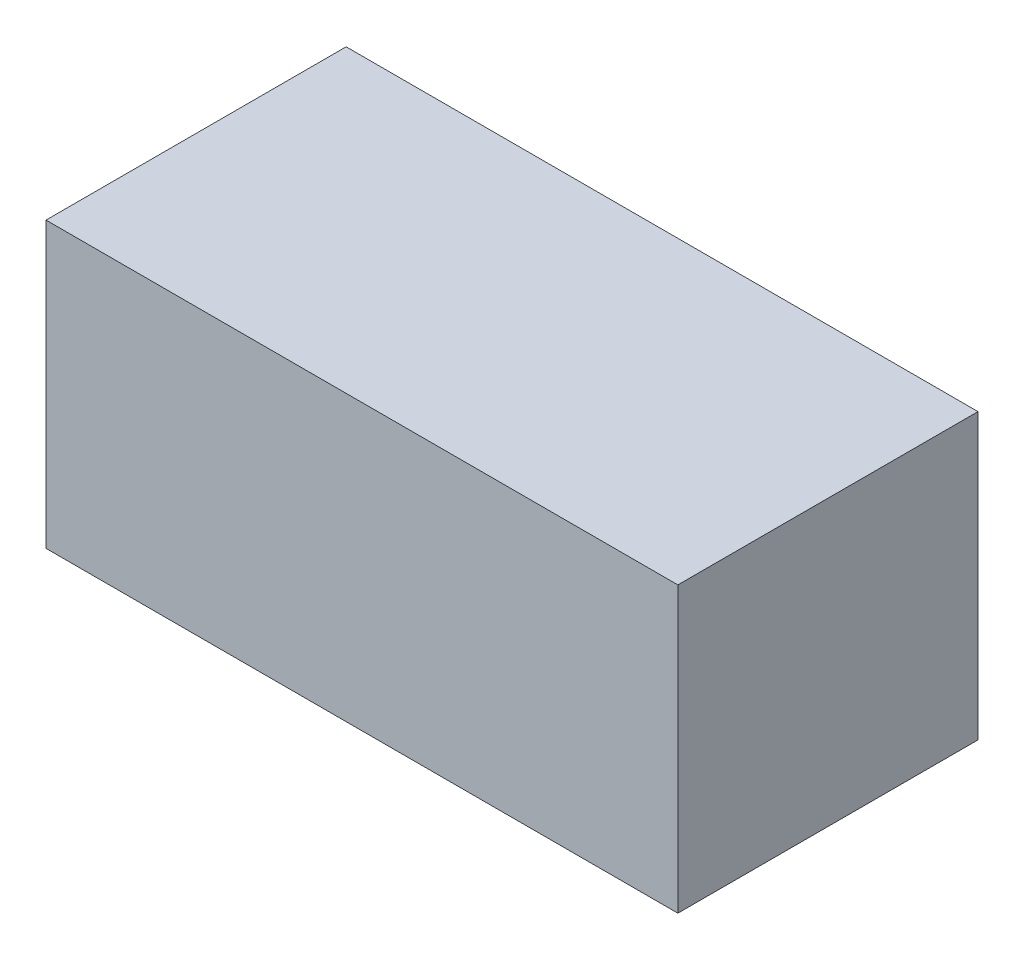
ISO-10303-21;
HEADER;
FILE_DESCRIPTION(('STEP AP214'),'2;1');
FILE_NAME('part.step','',(''),(''),'','','');
FILE_SCHEMA(('AUTOMOTIVE_DESIGN { 1 0 10303 214 1 1 1 1 }'));
ENDSEC;
DATA;
#1=APPLICATION_CONTEXT('core data for automotive mechanical design processes');
#2=APPLICATION_PROTOCOL_DEFINITION('international standard','automotive_design',2000,#1);
#3=PRODUCT_CONTEXT('',#1,'mechanical');
#4=PRODUCT('Part','Part','',(#3));
#5=PRODUCT_RELATED_PRODUCT_CATEGORY('part','',(#4));
#6=PRODUCT_DEFINITION_FORMATION('','',#4);
#7=PRODUCT_DEFINITION_CONTEXT('part definition',#1,'design');
#8=PRODUCT_DEFINITION('design','',#6,#7);
#9=PRODUCT_DEFINITION_SHAPE('','',#8);
#10=(LENGTH_UNIT() NAMED_UNIT(*) SI_UNIT(.MILLI.,.METRE.));
#11=(NAMED_UNIT(*) PLANE_ANGLE_UNIT() SI_UNIT($,.RADIAN.));
#12=(NAMED_UNIT(*) SI_UNIT($,.STERADIAN.) SOLID_ANGLE_UNIT());
#13=UNCERTAINTY_MEASURE_WITH_UNIT(LENGTH_MEASURE(1.E-05),#10,'distance_accuracy_value','');
#14=(GEOMETRIC_REPRESENTATION_CONTEXT(3) GLOBAL_UNCERTAINTY_ASSIGNED_CONTEXT((#13)) GLOBAL_UNIT_ASSIGNED_CONTEXT((#10,
#11,#12)) REPRESENTATION_CONTEXT('',''));
#15=CARTESIAN_POINT('',(0.,0.,0.));
#16=DIRECTION('',(0.,0.,1.));
#17=DIRECTION('',(1.,0.,0.));
#18=AXIS2_PLACEMENT_3D('',#15,#16,#17);
#19=CARTESIAN_POINT('',(0.,90.,-95.));
#20=DIRECTION('',(0.,0.,-1.));
#21=DIRECTION('',(-1.,0.,0.));
#22=AXIS2_PLACEMENT_3D('',#19,#20,#21);
#23=PLANE('',#22);
#24=DIRECTION('',(1.,0.,0.));
#25=VECTOR('',#24,1.);
#26=CARTESIAN_POINT('',(0.,0.,-95.));
#27=LINE('',#26,#25);
#28=CARTESIAN_POINT('',(0.,0.,-95.));
#29=VERTEX_POINT('',#28);
#30=CARTESIAN_POINT('',(200.,0.,-95.));
#31=VERTEX_POINT('',#30);
#32=EDGE_CURVE('E100',#29,#31,#27,.T.);
#33=ORIENTED_EDGE('',*,*,#32,.F.);
#34=DIRECTION('',(0.,-1.,0.));
#35=VECTOR('',#34,1.);
#36=CARTESIAN_POINT('',(0.,90.,-95.));
#37=LINE('',#36,#35);
#38=CARTESIAN_POINT('',(0.,90.,-95.));
#39=VERTEX_POINT('',#38);
#40=EDGE_CURVE('E11',#39,#29,#37,.T.);
#41=ORIENTED_EDGE('',*,*,#40,.F.);
#42=DIRECTION('',(1.,0.,0.));
#43=VECTOR('',#42,1.);
#44=CARTESIAN_POINT('',(0.,90.,-95.));
#45=LINE('',#44,#43);
#46=CARTESIAN_POINT('',(200.,90.,-95.));
#47=VERTEX_POINT('',#46);
#48=EDGE_CURVE('E93',#39,#47,#45,.T.);
#49=ORIENTED_EDGE('',*,*,#48,.T.);
#50=DIRECTION('',(0.,-1.,0.));
#51=VECTOR('',#50,1.);
#52=CARTESIAN_POINT('',(200.,90.,-95.));
#53=LINE('',#52,#51);
#54=EDGE_CURVE('E38',#47,#31,#53,.T.);
#55=ORIENTED_EDGE('',*,*,#54,.T.);
#56=EDGE_LOOP('',(#33,#41,#49,#55));
#57=FACE_BOUND('',#56,.T.);
#58=ADVANCED_FACE('F35',(#57),#23,.T.);
#59=CARTESIAN_POINT('',(0.,90.,0.));
#60=DIRECTION('',(-1.,0.,0.));
#61=DIRECTION('',(0.,0.,1.));
#62=AXIS2_PLACEMENT_3D('',#59,#60,#61);
#63=PLANE('',#62);
#64=DIRECTION('',(0.,0.,-1.));
#65=VECTOR('',#64,1.);
#66=CARTESIAN_POINT('',(0.,0.,0.));
#67=LINE('',#66,#65);
#68=CARTESIAN_POINT('',(0.,0.,0.));
#69=VERTEX_POINT('',#68);
#70=EDGE_CURVE('E95',#69,#29,#67,.T.);
#71=ORIENTED_EDGE('',*,*,#70,.F.);
#72=DIRECTION('',(0.,-1.,0.));
#73=VECTOR('',#72,1.);
#74=CARTESIAN_POINT('',(0.,90.,0.));
#75=LINE('',#74,#73);
#76=CARTESIAN_POINT('',(0.,90.,0.));
#77=VERTEX_POINT('',#76);
#78=EDGE_CURVE('E44',#77,#69,#75,.T.);
#79=ORIENTED_EDGE('',*,*,#78,.F.);
#80=DIRECTION('',(0.,0.,-1.));
#81=VECTOR('',#80,1.);
#82=CARTESIAN_POINT('',(0.,90.,0.));
#83=LINE('',#82,#81);
#84=EDGE_CURVE('E83',#77,#39,#83,.T.);
#85=ORIENTED_EDGE('',*,*,#84,.T.);
#86=ORIENTED_EDGE('',*,*,#40,.T.);
#87=EDGE_LOOP('',(#71,#79,#85,#86));
#88=FACE_BOUND('',#87,.T.);
#89=ADVANCED_FACE('F111',(#88),#63,.T.);
#90=CARTESIAN_POINT('',(0.,90.,0.));
#91=DIRECTION('',(0.,0.,-1.));
#92=DIRECTION('',(-1.,0.,0.));
#93=AXIS2_PLACEMENT_3D('',#90,#91,#92);
#94=PLANE('',#93);
#95=DIRECTION('',(1.,0.,0.));
#96=VECTOR('',#95,1.);
#97=CARTESIAN_POINT('',(0.,0.,0.));
#98=LINE('',#97,#96);
#99=CARTESIAN_POINT('',(200.,0.,0.));
#100=VERTEX_POINT('',#99);
#101=EDGE_CURVE('E88',#69,#100,#98,.T.);
#102=ORIENTED_EDGE('',*,*,#101,.T.);
#103=DIRECTION('',(0.,-1.,0.));
#104=VECTOR('',#103,1.);
#105=CARTESIAN_POINT('',(200.,90.,0.));
#106=LINE('',#105,#104);
#107=CARTESIAN_POINT('',(200.,90.,0.));
#108=VERTEX_POINT('',#107);
#109=EDGE_CURVE('E86',#108,#100,#106,.T.);
#110=ORIENTED_EDGE('',*,*,#109,.F.);
#111=DIRECTION('',(1.,0.,0.));
#112=VECTOR('',#111,1.);
#113=CARTESIAN_POINT('',(0.,90.,0.));
#114=LINE('',#113,#112);
#115=EDGE_CURVE('E80',#77,#108,#114,.T.);
#116=ORIENTED_EDGE('',*,*,#115,.F.);
#117=ORIENTED_EDGE('',*,*,#78,.T.);
#118=EDGE_LOOP('',(#102,#110,#116,#117));
#119=FACE_BOUND('',#118,.T.);
#120=ADVANCED_FACE('F87',(#119),#94,.F.);
#121=CARTESIAN_POINT('',(200.,90.,0.));
#122=DIRECTION('',(-1.,0.,0.));
#123=DIRECTION('',(0.,0.,1.));
#124=AXIS2_PLACEMENT_3D('',#121,#122,#123);
#125=PLANE('',#124);
#126=DIRECTION('',(0.,0.,-1.));
#127=VECTOR('',#126,1.);
#128=CARTESIAN_POINT('',(200.,0.,0.));
#129=LINE('',#128,#127);
#130=EDGE_CURVE('E103',#100,#31,#129,.T.);
#131=ORIENTED_EDGE('',*,*,#130,.T.);
#132=ORIENTED_EDGE('',*,*,#54,.F.);
#133=DIRECTION('',(0.,0.,-1.));
#134=VECTOR('',#133,1.);
#135=CARTESIAN_POINT('',(200.,90.,0.));
#136=LINE('',#135,#134);
#137=EDGE_CURVE('E77',#108,#47,#136,.T.);
#138=ORIENTED_EDGE('',*,*,#137,.F.);
#139=ORIENTED_EDGE('',*,*,#109,.T.);
#140=EDGE_LOOP('',(#131,#132,#138,#139));
#141=FACE_BOUND('',#140,.T.);
#142=ADVANCED_FACE('F92',(#141),#125,.F.);
#143=CARTESIAN_POINT('',(0.,90.,0.));
#144=DIRECTION('',(0.,1.,0.));
#145=DIRECTION('',(0.,0.,1.));
#146=AXIS2_PLACEMENT_3D('',#143,#144,#145);
#147=PLANE('',#146);
#148=ORIENTED_EDGE('',*,*,#48,.F.);
#149=ORIENTED_EDGE('',*,*,#84,.F.);
#150=ORIENTED_EDGE('',*,*,#115,.T.);
#151=ORIENTED_EDGE('',*,*,#137,.T.);
#152=EDGE_LOOP('',(#148,#149,#150,#151));
#153=FACE_BOUND('',#152,.T.);
#154=ADVANCED_FACE('F82',(#153),#147,.T.);
#155=CARTESIAN_POINT('',(0.,0.,0.));
#156=DIRECTION('',(0.,1.,0.));
#157=DIRECTION('',(0.,0.,1.));
#158=AXIS2_PLACEMENT_3D('',#155,#156,#157);
#159=PLANE('',#158);
#160=CARTESIAN_POINT('',(50.,0.,-47.5));
#161=DIRECTION('',(0.,-1.,0.));
#162=DIRECTION('',(0.,0.,-1.));
#163=AXIS2_PLACEMENT_3D('',#160,#161,#162);
#164=CIRCLE('',#163,30.);
#165=CARTESIAN_POINT('',(50.,0.,-77.5));
#166=VERTEX_POINT('',#165);
#167=EDGE_CURVE('E142',#166,#166,#164,.T.);
#168=ORIENTED_EDGE('',*,*,#167,.F.);
#169=EDGE_LOOP('',(#168));
#170=FACE_BOUND('',#169,.T.);
#171=ORIENTED_EDGE('',*,*,#32,.T.);
#172=ORIENTED_EDGE('',*,*,#130,.F.);
#173=ORIENTED_EDGE('',*,*,#101,.F.);
#174=ORIENTED_EDGE('',*,*,#70,.T.);
#175=EDGE_LOOP('',(#171,#172,#173,#174));
#176=FACE_BOUND('',#175,.T.);
#177=ADVANCED_FACE('F110',(#170,#176),#159,.F.);
#178=CARTESIAN_POINT('',(50.,10.,-47.5));
#179=DIRECTION('',(0.,-1.,0.));
#180=DIRECTION('',(0.,0.,-1.));
#181=AXIS2_PLACEMENT_3D('',#178,#179,#180);
#182=CYLINDRICAL_SURFACE('',#181,30.);
#183=CARTESIAN_POINT('',(50.,10.,-47.5));
#184=DIRECTION('',(0.,-1.,0.));
#185=DIRECTION('',(0.,0.,-1.));
#186=AXIS2_PLACEMENT_3D('',#183,#184,#185);
#187=CIRCLE('',#186,30.);
#188=CARTESIAN_POINT('',(50.,10.,-77.5));
#189=VERTEX_POINT('',#188);
#190=EDGE_CURVE('E104',#189,#189,#187,.T.);
#191=ORIENTED_EDGE('',*,*,#190,.F.);
#192=EDGE_LOOP('',(#191));
#193=FACE_BOUND('',#192,.T.);
#194=ORIENTED_EDGE('',*,*,#167,.T.);
#195=EDGE_LOOP('',(#194));
#196=FACE_BOUND('',#195,.T.);
#197=ADVANCED_FACE('F129',(#193,#196),#182,.F.);
#198=CARTESIAN_POINT('',(50.,10.,-47.5));
#199=DIRECTION('',(0.,-1.,0.));
#200=DIRECTION('',(0.,0.,-1.));
#201=AXIS2_PLACEMENT_3D('',#198,#199,#200);
#202=PLANE('',#201);
#203=ORIENTED_EDGE('',*,*,#190,.T.);
#204=EDGE_LOOP('',(#203));
#205=FACE_BOUND('',#204,.T.);
#206=ADVANCED_FACE('F134',(#205),#202,.T.);
#207=CLOSED_SHELL('',(#58,#89,#120,#142,#154,#177,#197,#206));
#208=MANIFOLD_SOLID_BREP('B2',#207);
#209=ADVANCED_BREP_SHAPE_REPRESENTATION('',(#18,#208),#14);
#210=SHAPE_DEFINITION_REPRESENTATION(#9,#209);
ENDSEC;
END-ISO-10303-21;
